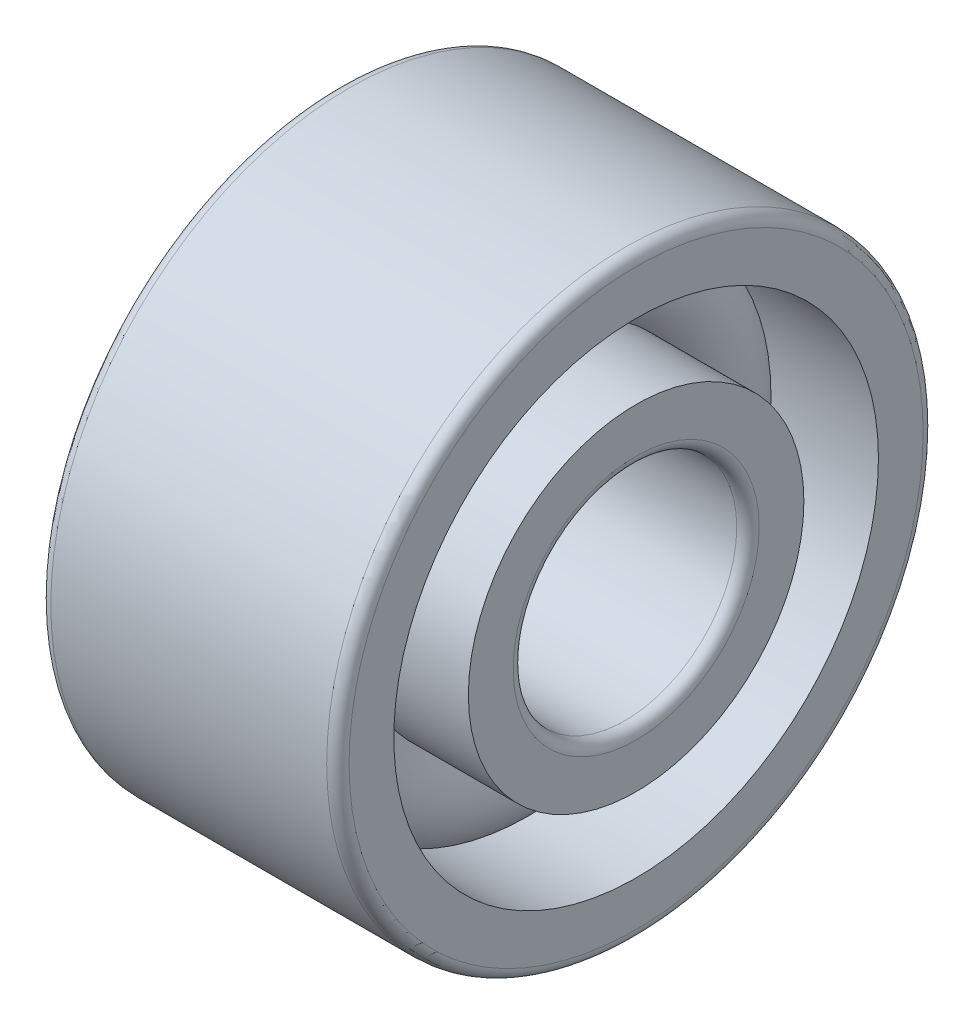
ISO-10303-21;
HEADER;
FILE_DESCRIPTION(('STEP AP214'),'2;1');
FILE_NAME('part.step','',(''),(''),'','','');
FILE_SCHEMA(('AUTOMOTIVE_DESIGN { 1 0 10303 214 1 1 1 1 }'));
ENDSEC;
DATA;
#1=APPLICATION_CONTEXT('core data for automotive mechanical design processes');
#2=APPLICATION_PROTOCOL_DEFINITION('international standard','automotive_design',2000,#1);
#3=PRODUCT_CONTEXT('',#1,'mechanical');
#4=PRODUCT('Part','Part','',(#3));
#5=PRODUCT_RELATED_PRODUCT_CATEGORY('part','',(#4));
#6=PRODUCT_DEFINITION_FORMATION('','',#4);
#7=PRODUCT_DEFINITION_CONTEXT('part definition',#1,'design');
#8=PRODUCT_DEFINITION('design','',#6,#7);
#9=PRODUCT_DEFINITION_SHAPE('','',#8);
#10=(LENGTH_UNIT() NAMED_UNIT(*) SI_UNIT(.MILLI.,.METRE.));
#11=(NAMED_UNIT(*) PLANE_ANGLE_UNIT() SI_UNIT($,.RADIAN.));
#12=(NAMED_UNIT(*) SI_UNIT($,.STERADIAN.) SOLID_ANGLE_UNIT());
#13=UNCERTAINTY_MEASURE_WITH_UNIT(LENGTH_MEASURE(1.E-05),#10,'distance_accuracy_value','');
#14=(GEOMETRIC_REPRESENTATION_CONTEXT(3) GLOBAL_UNCERTAINTY_ASSIGNED_CONTEXT((#13)) GLOBAL_UNIT_ASSIGNED_CONTEXT((#10,
#11,#12)) REPRESENTATION_CONTEXT('',''));
#15=CARTESIAN_POINT('',(0.,0.,0.));
#16=DIRECTION('',(0.,0.,1.));
#17=DIRECTION('',(1.,0.,0.));
#18=AXIS2_PLACEMENT_3D('',#15,#16,#17);
#19=CARTESIAN_POINT('',(0.,0.,0.));
#20=DIRECTION('',(-1.,0.,0.));
#21=DIRECTION('',(0.,0.,1.));
#22=AXIS2_PLACEMENT_3D('',#19,#20,#21);
#23=TOROIDAL_SURFACE('',#22,2.75,0.75);
#24=CARTESIAN_POINT('',(0.559016994374943,0.,0.));
#25=DIRECTION('',(-1.,0.,0.));
#26=DIRECTION('',(0.,0.,1.));
#27=AXIS2_PLACEMENT_3D('',#24,#25,#26);
#28=CIRCLE('',#27,3.25);
#29=CARTESIAN_POINT('',(0.559016994374943,0.,3.25));
#30=VERTEX_POINT('',#29);
#31=EDGE_CURVE('E35',#30,#30,#28,.F.);
#32=ORIENTED_EDGE('',*,*,#31,.T.);
#33=EDGE_LOOP('',(#32));
#34=FACE_BOUND('',#33,.T.);
#35=CARTESIAN_POINT('',(0.559016994374947,0.,0.));
#36=DIRECTION('',(-1.,0.,0.));
#37=DIRECTION('',(0.,0.,1.));
#38=AXIS2_PLACEMENT_3D('',#35,#36,#37);
#39=CIRCLE('',#38,2.25);
#40=CARTESIAN_POINT('',(0.559016994374947,0.,2.25));
#41=VERTEX_POINT('',#40);
#42=EDGE_CURVE('E10',#41,#41,#39,.T.);
#43=ORIENTED_EDGE('',*,*,#42,.T.);
#44=EDGE_LOOP('',(#43));
#45=FACE_BOUND('',#44,.T.);
#46=ADVANCED_FACE('F31',(#34,#45),#23,.T.);
#47=CARTESIAN_POINT('',(-20.6375,0.,0.));
#48=DIRECTION('',(1.,0.,0.));
#49=DIRECTION('',(0.,0.,-1.));
#50=AXIS2_PLACEMENT_3D('',#47,#48,#49);
#51=CYLINDRICAL_SURFACE('',#50,2.25);
#52=CARTESIAN_POINT('',(2.,0.,0.));
#53=DIRECTION('',(1.,0.,0.));
#54=DIRECTION('',(0.,0.,-1.));
#55=AXIS2_PLACEMENT_3D('',#52,#53,#54);
#56=CIRCLE('',#55,2.25);
#57=CARTESIAN_POINT('',(2.,0.,-2.25));
#58=VERTEX_POINT('',#57);
#59=EDGE_CURVE('E44',#58,#58,#56,.T.);
#60=ORIENTED_EDGE('',*,*,#59,.F.);
#61=EDGE_LOOP('',(#60));
#62=FACE_BOUND('',#61,.T.);
#63=ORIENTED_EDGE('',*,*,#42,.F.);
#64=EDGE_LOOP('',(#63));
#65=FACE_BOUND('',#64,.T.);
#66=ADVANCED_FACE('F83',(#62,#65),#51,.T.);
#67=CARTESIAN_POINT('',(-20.6375,0.,0.));
#68=DIRECTION('',(1.,0.,0.));
#69=DIRECTION('',(0.,0.,-1.));
#70=AXIS2_PLACEMENT_3D('',#67,#68,#69);
#71=CYLINDRICAL_SURFACE('',#70,2.25);
#72=CARTESIAN_POINT('',(-2.,0.,0.));
#73=DIRECTION('',(1.,0.,0.));
#74=DIRECTION('',(0.,0.,-1.));
#75=AXIS2_PLACEMENT_3D('',#72,#73,#74);
#76=CIRCLE('',#75,2.25);
#77=CARTESIAN_POINT('',(-2.,0.,-2.25));
#78=VERTEX_POINT('',#77);
#79=EDGE_CURVE('E53',#78,#78,#76,.T.);
#80=ORIENTED_EDGE('',*,*,#79,.T.);
#81=EDGE_LOOP('',(#80));
#82=FACE_BOUND('',#81,.T.);
#83=CARTESIAN_POINT('',(-0.559016994374947,0.,0.));
#84=DIRECTION('',(1.,0.,0.));
#85=DIRECTION('',(0.,0.,-1.));
#86=AXIS2_PLACEMENT_3D('',#83,#84,#85);
#87=CIRCLE('',#86,2.25);
#88=CARTESIAN_POINT('',(-0.559016994374947,0.,-2.25));
#89=VERTEX_POINT('',#88);
#90=EDGE_CURVE('E39',#89,#89,#87,.T.);
#91=ORIENTED_EDGE('',*,*,#90,.F.);
#92=EDGE_LOOP('',(#91));
#93=FACE_BOUND('',#92,.T.);
#94=ADVANCED_FACE('F86',(#82,#93),#71,.T.);
#95=CARTESIAN_POINT('',(2.,1.65,0.));
#96=DIRECTION('',(1.,0.,0.));
#97=DIRECTION('',(0.,0.,-1.));
#98=AXIS2_PLACEMENT_3D('',#95,#96,#97);
#99=PLANE('',#98);
#100=ORIENTED_EDGE('',*,*,#59,.T.);
#101=EDGE_LOOP('',(#100));
#102=FACE_BOUND('',#101,.T.);
#103=CARTESIAN_POINT('',(2.,0.,0.));
#104=DIRECTION('',(1.,0.,0.));
#105=DIRECTION('',(0.,0.,-1.));
#106=AXIS2_PLACEMENT_3D('',#103,#104,#105);
#107=CIRCLE('',#106,1.65);
#108=CARTESIAN_POINT('',(2.,0.,-1.65));
#109=VERTEX_POINT('',#108);
#110=EDGE_CURVE('E75',#109,#109,#107,.T.);
#111=ORIENTED_EDGE('',*,*,#110,.F.);
#112=EDGE_LOOP('',(#111));
#113=FACE_BOUND('',#112,.T.);
#114=ADVANCED_FACE('F80',(#102,#113),#99,.T.);
#115=CARTESIAN_POINT('',(1.85,0.,0.));
#116=DIRECTION('',(1.,0.,0.));
#117=DIRECTION('',(0.,0.,-1.));
#118=AXIS2_PLACEMENT_3D('',#115,#116,#117);
#119=TOROIDAL_SURFACE('',#118,1.65,0.15);
#120=ORIENTED_EDGE('',*,*,#110,.T.);
#121=EDGE_LOOP('',(#120));
#122=FACE_BOUND('',#121,.T.);
#123=CARTESIAN_POINT('',(1.85,0.,0.));
#124=DIRECTION('',(1.,0.,0.));
#125=DIRECTION('',(0.,0.,-1.));
#126=AXIS2_PLACEMENT_3D('',#123,#124,#125);
#127=CIRCLE('',#126,1.5);
#128=CARTESIAN_POINT('',(1.85,0.,-1.5));
#129=VERTEX_POINT('',#128);
#130=EDGE_CURVE('E72',#129,#129,#127,.T.);
#131=ORIENTED_EDGE('',*,*,#130,.F.);
#132=EDGE_LOOP('',(#131));
#133=FACE_BOUND('',#132,.T.);
#134=ADVANCED_FACE('F97',(#122,#133),#119,.T.);
#135=CARTESIAN_POINT('',(-20.6375,0.,0.));
#136=DIRECTION('',(1.,0.,0.));
#137=DIRECTION('',(0.,0.,-1.));
#138=AXIS2_PLACEMENT_3D('',#135,#136,#137);
#139=CYLINDRICAL_SURFACE('',#138,1.5);
#140=ORIENTED_EDGE('',*,*,#130,.T.);
#141=EDGE_LOOP('',(#140));
#142=FACE_BOUND('',#141,.T.);
#143=CARTESIAN_POINT('',(-1.85,0.,0.));
#144=DIRECTION('',(1.,0.,0.));
#145=DIRECTION('',(0.,0.,-1.));
#146=AXIS2_PLACEMENT_3D('',#143,#144,#145);
#147=CIRCLE('',#146,1.5);
#148=CARTESIAN_POINT('',(-1.85,0.,-1.5));
#149=VERTEX_POINT('',#148);
#150=EDGE_CURVE('E69',#149,#149,#147,.T.);
#151=ORIENTED_EDGE('',*,*,#150,.F.);
#152=EDGE_LOOP('',(#151));
#153=FACE_BOUND('',#152,.T.);
#154=ADVANCED_FACE('F100',(#142,#153),#139,.F.);
#155=CARTESIAN_POINT('',(-1.85,0.,0.));
#156=DIRECTION('',(1.,0.,0.));
#157=DIRECTION('',(0.,0.,-1.));
#158=AXIS2_PLACEMENT_3D('',#155,#156,#157);
#159=TOROIDAL_SURFACE('',#158,1.65,0.15);
#160=ORIENTED_EDGE('',*,*,#150,.T.);
#161=EDGE_LOOP('',(#160));
#162=FACE_BOUND('',#161,.T.);
#163=CARTESIAN_POINT('',(-2.,0.,0.));
#164=DIRECTION('',(1.,0.,0.));
#165=DIRECTION('',(0.,0.,-1.));
#166=AXIS2_PLACEMENT_3D('',#163,#164,#165);
#167=CIRCLE('',#166,1.65);
#168=CARTESIAN_POINT('',(-2.,0.,-1.65));
#169=VERTEX_POINT('',#168);
#170=EDGE_CURVE('E66',#169,#169,#167,.T.);
#171=ORIENTED_EDGE('',*,*,#170,.F.);
#172=EDGE_LOOP('',(#171));
#173=FACE_BOUND('',#172,.T.);
#174=ADVANCED_FACE('F104',(#162,#173),#159,.T.);
#175=CARTESIAN_POINT('',(-2.,2.25,0.));
#176=DIRECTION('',(-1.,0.,0.));
#177=DIRECTION('',(0.,0.,1.));
#178=AXIS2_PLACEMENT_3D('',#175,#176,#177);
#179=PLANE('',#178);
#180=ORIENTED_EDGE('',*,*,#170,.T.);
#181=EDGE_LOOP('',(#180));
#182=FACE_BOUND('',#181,.T.);
#183=ORIENTED_EDGE('',*,*,#79,.F.);
#184=EDGE_LOOP('',(#183));
#185=FACE_BOUND('',#184,.T.);
#186=ADVANCED_FACE('F108',(#182,#185),#179,.T.);
#187=CARTESIAN_POINT('',(-0.559016994374943,0.,0.));
#188=DIRECTION('',(1.,0.,0.));
#189=DIRECTION('',(0.,0.,-1.));
#190=AXIS2_PLACEMENT_3D('',#187,#188,#189);
#191=CIRCLE('',#190,3.25);
#192=CARTESIAN_POINT('',(-0.559016994374943,0.,-3.25));
#193=VERTEX_POINT('',#192);
#194=EDGE_CURVE('E47',#193,#193,#191,.F.);
#195=ORIENTED_EDGE('',*,*,#194,.T.);
#196=EDGE_LOOP('',(#195));
#197=FACE_BOUND('',#196,.T.);
#198=ORIENTED_EDGE('',*,*,#90,.T.);
#199=EDGE_LOOP('',(#198));
#200=FACE_BOUND('',#199,.T.);
#201=ADVANCED_FACE('F33',(#197,#200),#23,.T.);
#202=CARTESIAN_POINT('',(-20.6375,0.,0.));
#203=DIRECTION('',(1.,0.,0.));
#204=DIRECTION('',(0.,0.,-1.));
#205=AXIS2_PLACEMENT_3D('',#202,#203,#204);
#206=CYLINDRICAL_SURFACE('',#205,3.25);
#207=CARTESIAN_POINT('',(2.,0.,0.));
#208=DIRECTION('',(1.,0.,0.));
#209=DIRECTION('',(0.,0.,-1.));
#210=AXIS2_PLACEMENT_3D('',#207,#208,#209);
#211=CIRCLE('',#210,3.25);
#212=CARTESIAN_POINT('',(2.,0.,-3.25));
#213=VERTEX_POINT('',#212);
#214=EDGE_CURVE('E49',#213,#213,#211,.T.);
#215=ORIENTED_EDGE('',*,*,#214,.T.);
#216=EDGE_LOOP('',(#215));
#217=FACE_BOUND('',#216,.T.);
#218=ORIENTED_EDGE('',*,*,#31,.F.);
#219=EDGE_LOOP('',(#218));
#220=FACE_BOUND('',#219,.T.);
#221=ADVANCED_FACE('F113',(#217,#220),#206,.F.);
#222=CARTESIAN_POINT('',(-20.6375,0.,0.));
#223=DIRECTION('',(1.,0.,0.));
#224=DIRECTION('',(0.,0.,-1.));
#225=AXIS2_PLACEMENT_3D('',#222,#223,#224);
#226=CYLINDRICAL_SURFACE('',#225,3.25);
#227=CARTESIAN_POINT('',(-2.,0.,0.));
#228=DIRECTION('',(1.,0.,0.));
#229=DIRECTION('',(0.,0.,-1.));
#230=AXIS2_PLACEMENT_3D('',#227,#228,#229);
#231=CIRCLE('',#230,3.25);
#232=CARTESIAN_POINT('',(-2.,0.,-3.25));
#233=VERTEX_POINT('',#232);
#234=EDGE_CURVE('E144',#233,#233,#231,.T.);
#235=ORIENTED_EDGE('',*,*,#234,.F.);
#236=EDGE_LOOP('',(#235));
#237=FACE_BOUND('',#236,.T.);
#238=ORIENTED_EDGE('',*,*,#194,.F.);
#239=EDGE_LOOP('',(#238));
#240=FACE_BOUND('',#239,.T.);
#241=ADVANCED_FACE('F116',(#237,#240),#226,.F.);
#242=CARTESIAN_POINT('',(2.,3.85000000000001,0.));
#243=DIRECTION('',(1.,0.,0.));
#244=DIRECTION('',(0.,0.,-1.));
#245=AXIS2_PLACEMENT_3D('',#242,#243,#244);
#246=PLANE('',#245);
#247=CARTESIAN_POINT('',(2.,0.,0.));
#248=DIRECTION('',(1.,0.,0.));
#249=DIRECTION('',(0.,0.,-1.));
#250=AXIS2_PLACEMENT_3D('',#247,#248,#249);
#251=CIRCLE('',#250,3.85000000000001);
#252=CARTESIAN_POINT('',(2.,0.,-3.85000000000001));
#253=VERTEX_POINT('',#252);
#254=EDGE_CURVE('E55',#253,#253,#251,.T.);
#255=ORIENTED_EDGE('',*,*,#254,.T.);
#256=EDGE_LOOP('',(#255));
#257=FACE_BOUND('',#256,.T.);
#258=ORIENTED_EDGE('',*,*,#214,.F.);
#259=EDGE_LOOP('',(#258));
#260=FACE_BOUND('',#259,.T.);
#261=ADVANCED_FACE('F117',(#257,#260),#246,.T.);
#262=CARTESIAN_POINT('',(1.85,0.,0.));
#263=DIRECTION('',(1.,0.,0.));
#264=DIRECTION('',(0.,0.,-1.));
#265=AXIS2_PLACEMENT_3D('',#262,#263,#264);
#266=TOROIDAL_SURFACE('',#265,3.85000000000001,0.15);
#267=CARTESIAN_POINT('',(1.85,0.,0.));
#268=DIRECTION('',(1.,0.,0.));
#269=DIRECTION('',(0.,0.,-1.));
#270=AXIS2_PLACEMENT_3D('',#267,#268,#269);
#271=CIRCLE('',#270,4.);
#272=CARTESIAN_POINT('',(1.85,0.,-4.));
#273=VERTEX_POINT('',#272);
#274=EDGE_CURVE('E60',#273,#273,#271,.T.);
#275=ORIENTED_EDGE('',*,*,#274,.T.);
#276=EDGE_LOOP('',(#275));
#277=FACE_BOUND('',#276,.T.);
#278=ORIENTED_EDGE('',*,*,#254,.F.);
#279=EDGE_LOOP('',(#278));
#280=FACE_BOUND('',#279,.T.);
#281=ADVANCED_FACE('F120',(#277,#280),#266,.T.);
#282=CARTESIAN_POINT('',(-20.6375,0.,0.));
#283=DIRECTION('',(1.,0.,0.));
#284=DIRECTION('',(0.,0.,-1.));
#285=AXIS2_PLACEMENT_3D('',#282,#283,#284);
#286=CYLINDRICAL_SURFACE('',#285,4.00000000000001);
#287=CARTESIAN_POINT('',(-1.85,0.,0.));
#288=DIRECTION('',(1.,0.,0.));
#289=DIRECTION('',(0.,0.,-1.));
#290=AXIS2_PLACEMENT_3D('',#287,#288,#289);
#291=CIRCLE('',#290,4.00000000000001);
#292=CARTESIAN_POINT('',(-1.85,0.,-4.00000000000001));
#293=VERTEX_POINT('',#292);
#294=EDGE_CURVE('E148',#293,#293,#291,.T.);
#295=ORIENTED_EDGE('',*,*,#294,.T.);
#296=EDGE_LOOP('',(#295));
#297=FACE_BOUND('',#296,.T.);
#298=ORIENTED_EDGE('',*,*,#274,.F.);
#299=EDGE_LOOP('',(#298));
#300=FACE_BOUND('',#299,.T.);
#301=ADVANCED_FACE('F124',(#297,#300),#286,.T.);
#302=CARTESIAN_POINT('',(-1.85,0.,0.));
#303=DIRECTION('',(1.,0.,0.));
#304=DIRECTION('',(0.,0.,-1.));
#305=AXIS2_PLACEMENT_3D('',#302,#303,#304);
#306=TOROIDAL_SURFACE('',#305,3.85000000000001,0.15);
#307=CARTESIAN_POINT('',(-2.,0.,0.));
#308=DIRECTION('',(1.,0.,0.));
#309=DIRECTION('',(0.,0.,-1.));
#310=AXIS2_PLACEMENT_3D('',#307,#308,#309);
#311=CIRCLE('',#310,3.85000000000001);
#312=CARTESIAN_POINT('',(-2.,0.,-3.85000000000001));
#313=VERTEX_POINT('',#312);
#314=EDGE_CURVE('E145',#313,#313,#311,.T.);
#315=ORIENTED_EDGE('',*,*,#314,.T.);
#316=EDGE_LOOP('',(#315));
#317=FACE_BOUND('',#316,.T.);
#318=ORIENTED_EDGE('',*,*,#294,.F.);
#319=EDGE_LOOP('',(#318));
#320=FACE_BOUND('',#319,.T.);
#321=ADVANCED_FACE('F128',(#317,#320),#306,.T.);
#322=CARTESIAN_POINT('',(-2.,3.25,0.));
#323=DIRECTION('',(-1.,0.,0.));
#324=DIRECTION('',(0.,0.,1.));
#325=AXIS2_PLACEMENT_3D('',#322,#323,#324);
#326=PLANE('',#325);
#327=ORIENTED_EDGE('',*,*,#234,.T.);
#328=EDGE_LOOP('',(#327));
#329=FACE_BOUND('',#328,.T.);
#330=ORIENTED_EDGE('',*,*,#314,.F.);
#331=EDGE_LOOP('',(#330));
#332=FACE_BOUND('',#331,.T.);
#333=ADVANCED_FACE('F132',(#329,#332),#326,.T.);
#334=CLOSED_SHELL('',(#46,#66,#94,#114,#134,#154,#174,#186,#201,#221,#241,#261,#281,#301,#321,#333));
#335=MANIFOLD_SOLID_BREP('B2',#334);
#336=ADVANCED_BREP_SHAPE_REPRESENTATION('',(#18,#335),#14);
#337=SHAPE_DEFINITION_REPRESENTATION(#9,#336);
ENDSEC;
END-ISO-10303-21;
